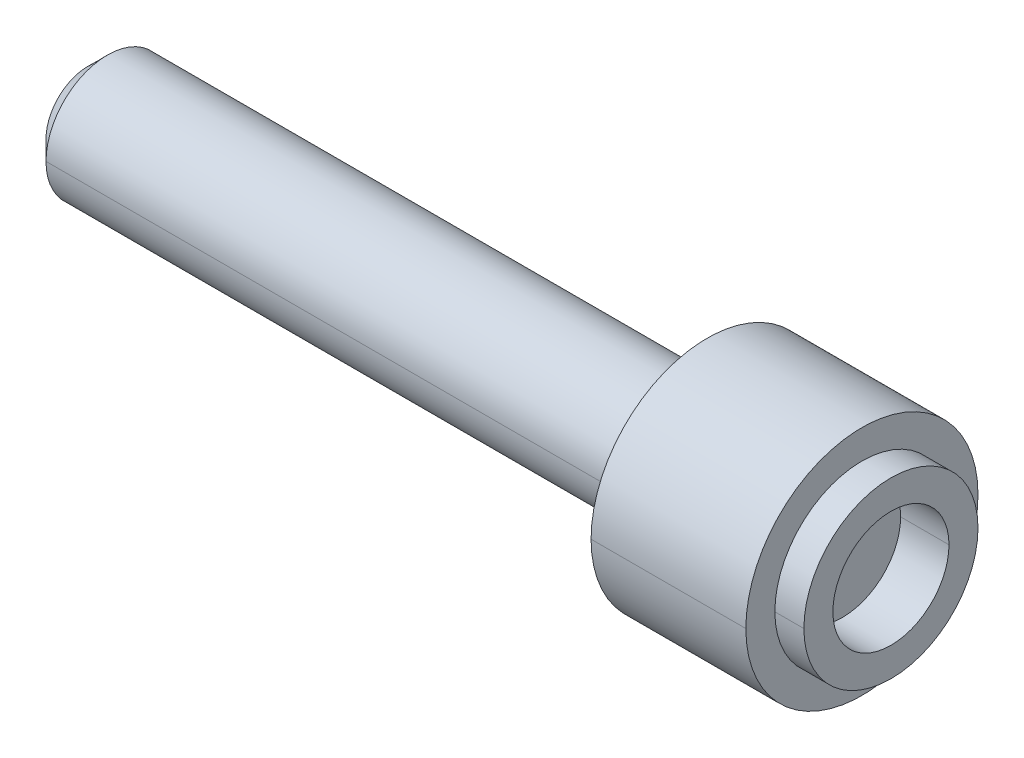
ISO-10303-21;
HEADER;
FILE_DESCRIPTION(('STEP AP214'),'2;1');
FILE_NAME('part.step','',(''),(''),'','','');
FILE_SCHEMA(('AUTOMOTIVE_DESIGN { 1 0 10303 214 1 1 1 1 }'));
ENDSEC;
DATA;
#1=APPLICATION_CONTEXT('core data for automotive mechanical design processes');
#2=APPLICATION_PROTOCOL_DEFINITION('international standard','automotive_design',2000,#1);
#3=PRODUCT_CONTEXT('',#1,'mechanical');
#4=PRODUCT('Part','Part','',(#3));
#5=PRODUCT_RELATED_PRODUCT_CATEGORY('part','',(#4));
#6=PRODUCT_DEFINITION_FORMATION('','',#4);
#7=PRODUCT_DEFINITION_CONTEXT('part definition',#1,'design');
#8=PRODUCT_DEFINITION('design','',#6,#7);
#9=PRODUCT_DEFINITION_SHAPE('','',#8);
#10=(LENGTH_UNIT() NAMED_UNIT(*) SI_UNIT(.MILLI.,.METRE.));
#11=(NAMED_UNIT(*) PLANE_ANGLE_UNIT() SI_UNIT($,.RADIAN.));
#12=(NAMED_UNIT(*) SI_UNIT($,.STERADIAN.) SOLID_ANGLE_UNIT());
#13=UNCERTAINTY_MEASURE_WITH_UNIT(LENGTH_MEASURE(1.E-05),#10,'distance_accuracy_value','');
#14=(GEOMETRIC_REPRESENTATION_CONTEXT(3) GLOBAL_UNCERTAINTY_ASSIGNED_CONTEXT((#13)) GLOBAL_UNIT_ASSIGNED_CONTEXT((#10,
#11,#12)) REPRESENTATION_CONTEXT('',''));
#15=CARTESIAN_POINT('',(0.,0.,0.));
#16=DIRECTION('',(0.,0.,1.));
#17=DIRECTION('',(1.,0.,0.));
#18=AXIS2_PLACEMENT_3D('',#15,#16,#17);
#19=CARTESIAN_POINT('',(0.,0.,0.));
#20=DIRECTION('',(1.,0.,0.));
#21=DIRECTION('',(0.,0.,-1.));
#22=AXIS2_PLACEMENT_3D('',#19,#20,#21);
#23=CONICAL_SURFACE('',#22,2.175,0.785398163397446);
#24=CARTESIAN_POINT('',(0.,0.,0.));
#25=DIRECTION('',(-1.,0.,0.));
#26=DIRECTION('',(0.,0.,-1.));
#27=AXIS2_PLACEMENT_3D('',#24,#25,#26);
#28=CIRCLE('',#27,2.175);
#29=CARTESIAN_POINT('',(0.,0.,2.175));
#30=VERTEX_POINT('',#29);
#31=CARTESIAN_POINT('',(0.,0.,-2.175));
#32=VERTEX_POINT('',#31);
#33=EDGE_CURVE('E41',#30,#32,#28,.T.);
#34=ORIENTED_EDGE('',*,*,#33,.F.);
#35=DIRECTION('',(0.707106781186549,0.,0.707106781186546));
#36=VECTOR('',#35,1.);
#37=CARTESIAN_POINT('',(0.,0.,2.175));
#38=LINE('',#37,#36);
#39=CARTESIAN_POINT('',(1.,0.,3.175));
#40=VERTEX_POINT('',#39);
#41=EDGE_CURVE('E11',#30,#40,#38,.T.);
#42=ORIENTED_EDGE('',*,*,#41,.T.);
#43=CARTESIAN_POINT('',(1.,0.,0.));
#44=DIRECTION('',(1.,0.,0.));
#45=DIRECTION('',(0.,0.,-1.));
#46=AXIS2_PLACEMENT_3D('',#43,#44,#45);
#47=CIRCLE('',#46,3.175);
#48=CARTESIAN_POINT('',(1.,0.,-3.175));
#49=VERTEX_POINT('',#48);
#50=EDGE_CURVE('E116',#49,#40,#47,.T.);
#51=ORIENTED_EDGE('',*,*,#50,.F.);
#52=DIRECTION('',(0.707106781186549,0.,-0.707106781186546));
#53=VECTOR('',#52,1.);
#54=CARTESIAN_POINT('',(0.,0.,-2.175));
#55=LINE('',#54,#53);
#56=EDGE_CURVE('E105',#32,#49,#55,.T.);
#57=ORIENTED_EDGE('',*,*,#56,.F.);
#58=EDGE_LOOP('',(#34,#42,#51,#57));
#59=FACE_BOUND('',#58,.T.);
#60=ADVANCED_FACE('F16',(#59),#23,.T.);
#61=CARTESIAN_POINT('',(0.,0.,0.));
#62=DIRECTION('',(-1.,0.,0.));
#63=DIRECTION('',(0.,0.,1.));
#64=AXIS2_PLACEMENT_3D('',#61,#62,#63);
#65=CYLINDRICAL_SURFACE('',#64,3.);
#66=CARTESIAN_POINT('',(41.5,0.,0.));
#67=DIRECTION('',(-1.,0.,0.));
#68=DIRECTION('',(0.,0.,1.));
#69=AXIS2_PLACEMENT_3D('',#66,#67,#68);
#70=CIRCLE('',#69,3.);
#71=CARTESIAN_POINT('',(41.5,0.,-3.));
#72=VERTEX_POINT('',#71);
#73=CARTESIAN_POINT('',(41.5,0.,3.));
#74=VERTEX_POINT('',#73);
#75=EDGE_CURVE('E200',#72,#74,#70,.T.);
#76=ORIENTED_EDGE('',*,*,#75,.F.);
#77=DIRECTION('',(-1.,0.,0.));
#78=VECTOR('',#77,1.);
#79=CARTESIAN_POINT('',(0.,0.,-3.));
#80=LINE('',#79,#78);
#81=CARTESIAN_POINT('',(39.,0.,-3.));
#82=VERTEX_POINT('',#81);
#83=EDGE_CURVE('E27',#72,#82,#80,.T.);
#84=ORIENTED_EDGE('',*,*,#83,.T.);
#85=CARTESIAN_POINT('',(39.,0.,0.));
#86=DIRECTION('',(-1.,0.,0.));
#87=DIRECTION('',(0.,0.,1.));
#88=AXIS2_PLACEMENT_3D('',#85,#86,#87);
#89=CIRCLE('',#88,3.);
#90=CARTESIAN_POINT('',(39.,0.,3.));
#91=VERTEX_POINT('',#90);
#92=EDGE_CURVE('E174',#82,#91,#89,.T.);
#93=ORIENTED_EDGE('',*,*,#92,.T.);
#94=DIRECTION('',(-1.,0.,0.));
#95=VECTOR('',#94,1.);
#96=CARTESIAN_POINT('',(0.,0.,3.));
#97=LINE('',#96,#95);
#98=EDGE_CURVE('E203',#74,#91,#97,.T.);
#99=ORIENTED_EDGE('',*,*,#98,.F.);
#100=EDGE_LOOP('',(#76,#84,#93,#99));
#101=FACE_BOUND('',#100,.T.);
#102=ADVANCED_FACE('F253',(#101),#65,.F.);
#103=CARTESIAN_POINT('',(0.,0.,0.));
#104=DIRECTION('',(-1.,0.,0.));
#105=DIRECTION('',(0.,0.,1.));
#106=AXIS2_PLACEMENT_3D('',#103,#104,#105);
#107=CYLINDRICAL_SURFACE('',#106,4.5);
#108=CARTESIAN_POINT('',(41.5,0.,0.));
#109=DIRECTION('',(-1.,0.,0.));
#110=DIRECTION('',(0.,0.,1.));
#111=AXIS2_PLACEMENT_3D('',#108,#109,#110);
#112=CIRCLE('',#111,4.5);
#113=CARTESIAN_POINT('',(41.5,0.,4.5));
#114=VERTEX_POINT('',#113);
#115=CARTESIAN_POINT('',(41.5,0.,-4.5));
#116=VERTEX_POINT('',#115);
#117=EDGE_CURVE('E176',#114,#116,#112,.T.);
#118=ORIENTED_EDGE('',*,*,#117,.T.);
#119=DIRECTION('',(-1.,0.,0.));
#120=VECTOR('',#119,1.);
#121=CARTESIAN_POINT('',(0.,0.,-4.5));
#122=LINE('',#121,#120);
#123=CARTESIAN_POINT('',(40.,0.,-4.5));
#124=VERTEX_POINT('',#123);
#125=EDGE_CURVE('E185',#116,#124,#122,.T.);
#126=ORIENTED_EDGE('',*,*,#125,.T.);
#127=CARTESIAN_POINT('',(40.,0.,0.));
#128=DIRECTION('',(-1.,0.,0.));
#129=DIRECTION('',(0.,0.,1.));
#130=AXIS2_PLACEMENT_3D('',#127,#128,#129);
#131=CIRCLE('',#130,4.5);
#132=CARTESIAN_POINT('',(40.,0.,4.5));
#133=VERTEX_POINT('',#132);
#134=EDGE_CURVE('E164',#133,#124,#131,.T.);
#135=ORIENTED_EDGE('',*,*,#134,.F.);
#136=DIRECTION('',(-1.,0.,0.));
#137=VECTOR('',#136,1.);
#138=CARTESIAN_POINT('',(0.,0.,4.5));
#139=LINE('',#138,#137);
#140=EDGE_CURVE('E209',#114,#133,#139,.T.);
#141=ORIENTED_EDGE('',*,*,#140,.F.);
#142=EDGE_LOOP('',(#118,#126,#135,#141));
#143=FACE_BOUND('',#142,.T.);
#144=ADVANCED_FACE('F257',(#143),#107,.T.);
#145=CARTESIAN_POINT('',(0.,0.,0.));
#146=DIRECTION('',(-1.,0.,0.));
#147=DIRECTION('',(0.,0.,1.));
#148=AXIS2_PLACEMENT_3D('',#145,#146,#147);
#149=CYLINDRICAL_SURFACE('',#148,6.);
#150=CARTESIAN_POINT('',(40.,0.,0.));
#151=DIRECTION('',(-1.,0.,0.));
#152=DIRECTION('',(0.,0.,1.));
#153=AXIS2_PLACEMENT_3D('',#150,#151,#152);
#154=CIRCLE('',#153,6.);
#155=CARTESIAN_POINT('',(40.,0.,6.));
#156=VERTEX_POINT('',#155);
#157=CARTESIAN_POINT('',(40.,0.,-6.));
#158=VERTEX_POINT('',#157);
#159=EDGE_CURVE('E196',#156,#158,#154,.T.);
#160=ORIENTED_EDGE('',*,*,#159,.T.);
#161=DIRECTION('',(-1.,0.,0.));
#162=VECTOR('',#161,1.);
#163=CARTESIAN_POINT('',(0.,0.,-6.));
#164=LINE('',#163,#162);
#165=CARTESIAN_POINT('',(32.,0.,-6.));
#166=VERTEX_POINT('',#165);
#167=EDGE_CURVE('E218',#158,#166,#164,.T.);
#168=ORIENTED_EDGE('',*,*,#167,.T.);
#169=CARTESIAN_POINT('',(32.,0.,0.));
#170=DIRECTION('',(-1.,0.,0.));
#171=DIRECTION('',(0.,0.,1.));
#172=AXIS2_PLACEMENT_3D('',#169,#170,#171);
#173=CIRCLE('',#172,6.);
#174=CARTESIAN_POINT('',(32.,0.,6.));
#175=VERTEX_POINT('',#174);
#176=EDGE_CURVE('E134',#175,#166,#173,.T.);
#177=ORIENTED_EDGE('',*,*,#176,.F.);
#178=DIRECTION('',(-1.,0.,0.));
#179=VECTOR('',#178,1.);
#180=CARTESIAN_POINT('',(0.,0.,6.));
#181=LINE('',#180,#179);
#182=EDGE_CURVE('E157',#156,#175,#181,.T.);
#183=ORIENTED_EDGE('',*,*,#182,.F.);
#184=EDGE_LOOP('',(#160,#168,#177,#183));
#185=FACE_BOUND('',#184,.T.);
#186=ADVANCED_FACE('F18',(#185),#149,.T.);
#187=CARTESIAN_POINT('',(0.,0.,0.));
#188=DIRECTION('',(-1.,0.,0.));
#189=DIRECTION('',(0.,0.,1.));
#190=AXIS2_PLACEMENT_3D('',#187,#188,#189);
#191=CYLINDRICAL_SURFACE('',#190,3.175);
#192=CARTESIAN_POINT('',(32.,0.,0.));
#193=DIRECTION('',(-1.,0.,0.));
#194=DIRECTION('',(0.,0.,1.));
#195=AXIS2_PLACEMENT_3D('',#192,#193,#194);
#196=CIRCLE('',#195,3.175);
#197=CARTESIAN_POINT('',(32.,0.,3.175));
#198=VERTEX_POINT('',#197);
#199=CARTESIAN_POINT('',(32.,0.,-3.175));
#200=VERTEX_POINT('',#199);
#201=EDGE_CURVE('E125',#198,#200,#196,.T.);
#202=ORIENTED_EDGE('',*,*,#201,.T.);
#203=DIRECTION('',(-1.,0.,0.));
#204=VECTOR('',#203,1.);
#205=CARTESIAN_POINT('',(0.,0.,-3.175));
#206=LINE('',#205,#204);
#207=EDGE_CURVE('E120',#200,#49,#206,.T.);
#208=ORIENTED_EDGE('',*,*,#207,.T.);
#209=ORIENTED_EDGE('',*,*,#50,.T.);
#210=DIRECTION('',(-1.,0.,0.));
#211=VECTOR('',#210,1.);
#212=CARTESIAN_POINT('',(0.,0.,3.175));
#213=LINE('',#212,#211);
#214=EDGE_CURVE('E132',#198,#40,#213,.T.);
#215=ORIENTED_EDGE('',*,*,#214,.F.);
#216=EDGE_LOOP('',(#202,#208,#209,#215));
#217=FACE_BOUND('',#216,.T.);
#218=ADVANCED_FACE('F123',(#217),#191,.T.);
#219=CARTESIAN_POINT('',(0.,0.,0.));
#220=DIRECTION('',(1.,0.,0.));
#221=DIRECTION('',(0.,1.,0.));
#222=AXIS2_PLACEMENT_3D('',#219,#220,#221);
#223=PLANE('',#222);
#224=CARTESIAN_POINT('',(0.,0.,0.));
#225=DIRECTION('',(-1.,0.,0.));
#226=DIRECTION('',(0.,0.,-1.));
#227=AXIS2_PLACEMENT_3D('',#224,#225,#226);
#228=CIRCLE('',#227,2.175);
#229=EDGE_CURVE('E111',#32,#30,#228,.T.);
#230=ORIENTED_EDGE('',*,*,#229,.T.);
#231=ORIENTED_EDGE('',*,*,#33,.T.);
#232=EDGE_LOOP('',(#230,#231));
#233=FACE_BOUND('',#232,.T.);
#234=ADVANCED_FACE('F249',(#233),#223,.F.);
#235=CARTESIAN_POINT('',(0.,0.,0.));
#236=DIRECTION('',(-1.,0.,0.));
#237=DIRECTION('',(0.,0.,1.));
#238=AXIS2_PLACEMENT_3D('',#235,#236,#237);
#239=CYLINDRICAL_SURFACE('',#238,3.175);
#240=ORIENTED_EDGE('',*,*,#207,.F.);
#241=CARTESIAN_POINT('',(32.,0.,0.));
#242=DIRECTION('',(-1.,0.,0.));
#243=DIRECTION('',(0.,0.,1.));
#244=AXIS2_PLACEMENT_3D('',#241,#242,#243);
#245=CIRCLE('',#244,3.175);
#246=EDGE_CURVE('E141',#200,#198,#245,.T.);
#247=ORIENTED_EDGE('',*,*,#246,.T.);
#248=ORIENTED_EDGE('',*,*,#214,.T.);
#249=CARTESIAN_POINT('',(1.,0.,0.));
#250=DIRECTION('',(1.,0.,0.));
#251=DIRECTION('',(0.,0.,-1.));
#252=AXIS2_PLACEMENT_3D('',#249,#250,#251);
#253=CIRCLE('',#252,3.175);
#254=EDGE_CURVE('E109',#40,#49,#253,.T.);
#255=ORIENTED_EDGE('',*,*,#254,.T.);
#256=EDGE_LOOP('',(#240,#247,#248,#255));
#257=FACE_BOUND('',#256,.T.);
#258=ADVANCED_FACE('F131',(#257),#239,.T.);
#259=CARTESIAN_POINT('',(32.,3.175,0.));
#260=DIRECTION('',(1.,0.,0.));
#261=DIRECTION('',(0.,1.,0.));
#262=AXIS2_PLACEMENT_3D('',#259,#260,#261);
#263=PLANE('',#262);
#264=ORIENTED_EDGE('',*,*,#176,.T.);
#265=CARTESIAN_POINT('',(32.,0.,0.));
#266=DIRECTION('',(-1.,0.,0.));
#267=DIRECTION('',(0.,0.,1.));
#268=AXIS2_PLACEMENT_3D('',#265,#266,#267);
#269=CIRCLE('',#268,6.);
#270=EDGE_CURVE('E145',#166,#175,#269,.T.);
#271=ORIENTED_EDGE('',*,*,#270,.T.);
#272=EDGE_LOOP('',(#264,#271));
#273=FACE_BOUND('',#272,.T.);
#274=ORIENTED_EDGE('',*,*,#201,.F.);
#275=ORIENTED_EDGE('',*,*,#246,.F.);
#276=EDGE_LOOP('',(#274,#275));
#277=FACE_BOUND('',#276,.T.);
#278=ADVANCED_FACE('F238',(#273,#277),#263,.F.);
#279=CARTESIAN_POINT('',(0.,0.,0.));
#280=DIRECTION('',(-1.,0.,0.));
#281=DIRECTION('',(0.,0.,1.));
#282=AXIS2_PLACEMENT_3D('',#279,#280,#281);
#283=CYLINDRICAL_SURFACE('',#282,6.);
#284=ORIENTED_EDGE('',*,*,#167,.F.);
#285=CARTESIAN_POINT('',(40.,0.,0.));
#286=DIRECTION('',(-1.,0.,0.));
#287=DIRECTION('',(0.,0.,1.));
#288=AXIS2_PLACEMENT_3D('',#285,#286,#287);
#289=CIRCLE('',#288,6.);
#290=EDGE_CURVE('E148',#158,#156,#289,.T.);
#291=ORIENTED_EDGE('',*,*,#290,.T.);
#292=ORIENTED_EDGE('',*,*,#182,.T.);
#293=ORIENTED_EDGE('',*,*,#270,.F.);
#294=EDGE_LOOP('',(#284,#291,#292,#293));
#295=FACE_BOUND('',#294,.T.);
#296=ADVANCED_FACE('F240',(#295),#283,.T.);
#297=CARTESIAN_POINT('',(40.,4.5,0.));
#298=DIRECTION('',(-1.,0.,0.));
#299=DIRECTION('',(0.,0.,1.));
#300=AXIS2_PLACEMENT_3D('',#297,#298,#299);
#301=PLANE('',#300);
#302=ORIENTED_EDGE('',*,*,#159,.F.);
#303=ORIENTED_EDGE('',*,*,#290,.F.);
#304=EDGE_LOOP('',(#302,#303));
#305=FACE_BOUND('',#304,.T.);
#306=ORIENTED_EDGE('',*,*,#134,.T.);
#307=CARTESIAN_POINT('',(40.,0.,0.));
#308=DIRECTION('',(-1.,0.,0.));
#309=DIRECTION('',(0.,0.,1.));
#310=AXIS2_PLACEMENT_3D('',#307,#308,#309);
#311=CIRCLE('',#310,4.5);
#312=EDGE_CURVE('E20',#124,#133,#311,.T.);
#313=ORIENTED_EDGE('',*,*,#312,.T.);
#314=EDGE_LOOP('',(#306,#313));
#315=FACE_BOUND('',#314,.T.);
#316=ADVANCED_FACE('F247',(#305,#315),#301,.F.);
#317=CARTESIAN_POINT('',(0.,0.,0.));
#318=DIRECTION('',(-1.,0.,0.));
#319=DIRECTION('',(0.,0.,1.));
#320=AXIS2_PLACEMENT_3D('',#317,#318,#319);
#321=CYLINDRICAL_SURFACE('',#320,4.5);
#322=ORIENTED_EDGE('',*,*,#125,.F.);
#323=CARTESIAN_POINT('',(41.5,0.,0.));
#324=DIRECTION('',(-1.,0.,0.));
#325=DIRECTION('',(0.,0.,1.));
#326=AXIS2_PLACEMENT_3D('',#323,#324,#325);
#327=CIRCLE('',#326,4.5);
#328=EDGE_CURVE('E205',#116,#114,#327,.T.);
#329=ORIENTED_EDGE('',*,*,#328,.T.);
#330=ORIENTED_EDGE('',*,*,#140,.T.);
#331=ORIENTED_EDGE('',*,*,#312,.F.);
#332=EDGE_LOOP('',(#322,#329,#330,#331));
#333=FACE_BOUND('',#332,.T.);
#334=ADVANCED_FACE('F308',(#333),#321,.T.);
#335=CARTESIAN_POINT('',(41.5,4.5,0.));
#336=DIRECTION('',(-1.,0.,0.));
#337=DIRECTION('',(0.,0.,1.));
#338=AXIS2_PLACEMENT_3D('',#335,#336,#337);
#339=PLANE('',#338);
#340=ORIENTED_EDGE('',*,*,#117,.F.);
#341=ORIENTED_EDGE('',*,*,#328,.F.);
#342=EDGE_LOOP('',(#340,#341));
#343=FACE_BOUND('',#342,.T.);
#344=CARTESIAN_POINT('',(41.5,0.,0.));
#345=DIRECTION('',(-1.,0.,0.));
#346=DIRECTION('',(0.,0.,1.));
#347=AXIS2_PLACEMENT_3D('',#344,#345,#346);
#348=CIRCLE('',#347,3.);
#349=EDGE_CURVE('E202',#74,#72,#348,.T.);
#350=ORIENTED_EDGE('',*,*,#349,.T.);
#351=ORIENTED_EDGE('',*,*,#75,.T.);
#352=EDGE_LOOP('',(#350,#351));
#353=FACE_BOUND('',#352,.T.);
#354=ADVANCED_FACE('F319',(#343,#353),#339,.F.);
#355=CARTESIAN_POINT('',(0.,0.,0.));
#356=DIRECTION('',(-1.,0.,0.));
#357=DIRECTION('',(0.,0.,1.));
#358=AXIS2_PLACEMENT_3D('',#355,#356,#357);
#359=CYLINDRICAL_SURFACE('',#358,3.);
#360=ORIENTED_EDGE('',*,*,#83,.F.);
#361=ORIENTED_EDGE('',*,*,#349,.F.);
#362=ORIENTED_EDGE('',*,*,#98,.T.);
#363=CARTESIAN_POINT('',(39.,0.,0.));
#364=DIRECTION('',(-1.,0.,0.));
#365=DIRECTION('',(0.,0.,1.));
#366=AXIS2_PLACEMENT_3D('',#363,#364,#365);
#367=CIRCLE('',#366,3.);
#368=EDGE_CURVE('E113',#91,#82,#367,.T.);
#369=ORIENTED_EDGE('',*,*,#368,.T.);
#370=EDGE_LOOP('',(#360,#361,#362,#369));
#371=FACE_BOUND('',#370,.T.);
#372=ADVANCED_FACE('F263',(#371),#359,.F.);
#373=CARTESIAN_POINT('',(39.,3.,0.));
#374=DIRECTION('',(-1.,0.,0.));
#375=DIRECTION('',(0.,0.,1.));
#376=AXIS2_PLACEMENT_3D('',#373,#374,#375);
#377=PLANE('',#376);
#378=ORIENTED_EDGE('',*,*,#368,.F.);
#379=ORIENTED_EDGE('',*,*,#92,.F.);
#380=EDGE_LOOP('',(#378,#379));
#381=FACE_BOUND('',#380,.T.);
#382=ADVANCED_FACE('F260',(#381),#377,.F.);
#383=CARTESIAN_POINT('',(0.,0.,0.));
#384=DIRECTION('',(1.,0.,0.));
#385=DIRECTION('',(0.,0.,-1.));
#386=AXIS2_PLACEMENT_3D('',#383,#384,#385);
#387=CONICAL_SURFACE('',#386,2.175,0.785398163397446);
#388=ORIENTED_EDGE('',*,*,#41,.F.);
#389=ORIENTED_EDGE('',*,*,#229,.F.);
#390=ORIENTED_EDGE('',*,*,#56,.T.);
#391=ORIENTED_EDGE('',*,*,#254,.F.);
#392=EDGE_LOOP('',(#388,#389,#390,#391));
#393=FACE_BOUND('',#392,.T.);
#394=ADVANCED_FACE('F107',(#393),#387,.T.);
#395=CLOSED_SHELL('',(#60,#102,#144,#186,#218,#234,#258,#278,#296,#316,#334,#354,#372,#382,#394));
#396=MANIFOLD_SOLID_BREP('B1',#395);
#397=ADVANCED_BREP_SHAPE_REPRESENTATION('',(#18,#396),#14);
#398=SHAPE_DEFINITION_REPRESENTATION(#9,#397);
ENDSEC;
END-ISO-10303-21;
